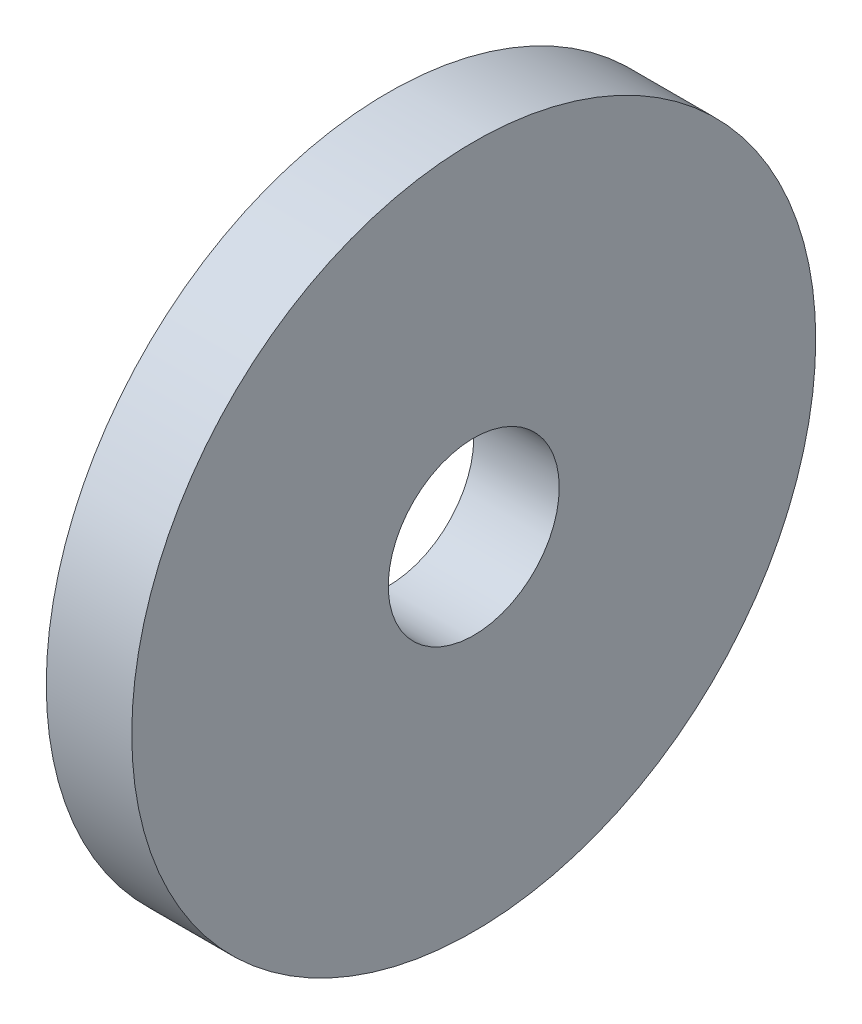
ISO-10303-21;
HEADER;
FILE_DESCRIPTION(('STEP AP214'),'2;1');
FILE_NAME('part.step','',(''),(''),'','','');
FILE_SCHEMA(('AUTOMOTIVE_DESIGN { 1 0 10303 214 1 1 1 1 }'));
ENDSEC;
DATA;
#1=APPLICATION_CONTEXT('core data for automotive mechanical design processes');
#2=APPLICATION_PROTOCOL_DEFINITION('international standard','automotive_design',2000,#1);
#3=PRODUCT_CONTEXT('',#1,'mechanical');
#4=PRODUCT('Part','Part','',(#3));
#5=PRODUCT_RELATED_PRODUCT_CATEGORY('part','',(#4));
#6=PRODUCT_DEFINITION_FORMATION('','',#4);
#7=PRODUCT_DEFINITION_CONTEXT('part definition',#1,'design');
#8=PRODUCT_DEFINITION('design','',#6,#7);
#9=PRODUCT_DEFINITION_SHAPE('','',#8);
#10=(LENGTH_UNIT() NAMED_UNIT(*) SI_UNIT(.MILLI.,.METRE.));
#11=(NAMED_UNIT(*) PLANE_ANGLE_UNIT() SI_UNIT($,.RADIAN.));
#12=(NAMED_UNIT(*) SI_UNIT($,.STERADIAN.) SOLID_ANGLE_UNIT());
#13=UNCERTAINTY_MEASURE_WITH_UNIT(LENGTH_MEASURE(1.E-05),#10,'distance_accuracy_value','');
#14=(GEOMETRIC_REPRESENTATION_CONTEXT(3) GLOBAL_UNCERTAINTY_ASSIGNED_CONTEXT((#13)) GLOBAL_UNIT_ASSIGNED_CONTEXT((#10,
#11,#12)) REPRESENTATION_CONTEXT('',''));
#15=CARTESIAN_POINT('',(0.,0.,0.));
#16=DIRECTION('',(0.,0.,1.));
#17=DIRECTION('',(1.,0.,0.));
#18=AXIS2_PLACEMENT_3D('',#15,#16,#17);
#19=CARTESIAN_POINT('',(3.175,0.,0.));
#20=DIRECTION('',(1.,0.,0.));
#21=DIRECTION('',(0.,0.,-1.));
#22=AXIS2_PLACEMENT_3D('',#19,#20,#21);
#23=PLANE('',#22);
#24=CARTESIAN_POINT('',(3.175,0.,0.));
#25=DIRECTION('',(1.,0.,0.));
#26=DIRECTION('',(0.,0.,-1.));
#27=AXIS2_PLACEMENT_3D('',#24,#25,#26);
#28=CIRCLE('',#27,12.7);
#29=CARTESIAN_POINT('',(3.175,0.,-12.7));
#30=VERTEX_POINT('',#29);
#31=EDGE_CURVE('E10',#30,#30,#28,.T.);
#32=ORIENTED_EDGE('',*,*,#31,.T.);
#33=EDGE_LOOP('',(#32));
#34=FACE_BOUND('',#33,.T.);
#35=CARTESIAN_POINT('',(3.175,0.,0.));
#36=DIRECTION('',(1.,0.,0.));
#37=DIRECTION('',(0.,0.,-1.));
#38=AXIS2_PLACEMENT_3D('',#35,#36,#37);
#39=CIRCLE('',#38,3.175);
#40=CARTESIAN_POINT('',(3.175,0.,-3.175));
#41=VERTEX_POINT('',#40);
#42=EDGE_CURVE('E56',#41,#41,#39,.T.);
#43=ORIENTED_EDGE('',*,*,#42,.F.);
#44=EDGE_LOOP('',(#43));
#45=FACE_BOUND('',#44,.T.);
#46=ADVANCED_FACE('F43',(#34,#45),#23,.T.);
#47=CARTESIAN_POINT('',(0.,0.,0.));
#48=DIRECTION('',(1.,0.,0.));
#49=DIRECTION('',(0.,0.,-1.));
#50=AXIS2_PLACEMENT_3D('',#47,#48,#49);
#51=PLANE('',#50);
#52=CARTESIAN_POINT('',(0.,0.,0.));
#53=DIRECTION('',(1.,0.,0.));
#54=DIRECTION('',(0.,0.,-1.));
#55=AXIS2_PLACEMENT_3D('',#52,#53,#54);
#56=CIRCLE('',#55,12.7);
#57=CARTESIAN_POINT('',(0.,0.,-12.7));
#58=VERTEX_POINT('',#57);
#59=EDGE_CURVE('E47',#58,#58,#56,.T.);
#60=ORIENTED_EDGE('',*,*,#59,.F.);
#61=EDGE_LOOP('',(#60));
#62=FACE_BOUND('',#61,.T.);
#63=CARTESIAN_POINT('',(0.,0.,0.));
#64=DIRECTION('',(1.,0.,0.));
#65=DIRECTION('',(0.,0.,-1.));
#66=AXIS2_PLACEMENT_3D('',#63,#64,#65);
#67=CIRCLE('',#66,3.175);
#68=CARTESIAN_POINT('',(0.,0.,-3.175));
#69=VERTEX_POINT('',#68);
#70=EDGE_CURVE('E58',#69,#69,#67,.T.);
#71=ORIENTED_EDGE('',*,*,#70,.T.);
#72=EDGE_LOOP('',(#71));
#73=FACE_BOUND('',#72,.T.);
#74=ADVANCED_FACE('F70',(#62,#73),#51,.F.);
#75=CARTESIAN_POINT('',(3.175,0.,0.));
#76=DIRECTION('',(-1.,0.,0.));
#77=DIRECTION('',(0.,0.,1.));
#78=AXIS2_PLACEMENT_3D('',#75,#76,#77);
#79=CYLINDRICAL_SURFACE('',#78,12.7);
#80=ORIENTED_EDGE('',*,*,#31,.F.);
#81=EDGE_LOOP('',(#80));
#82=FACE_BOUND('',#81,.T.);
#83=ORIENTED_EDGE('',*,*,#59,.T.);
#84=EDGE_LOOP('',(#83));
#85=FACE_BOUND('',#84,.T.);
#86=ADVANCED_FACE('F45',(#82,#85),#79,.T.);
#87=CARTESIAN_POINT('',(3.175,0.,0.));
#88=DIRECTION('',(-1.,0.,0.));
#89=DIRECTION('',(0.,0.,1.));
#90=AXIS2_PLACEMENT_3D('',#87,#88,#89);
#91=CYLINDRICAL_SURFACE('',#90,3.175);
#92=ORIENTED_EDGE('',*,*,#42,.T.);
#93=EDGE_LOOP('',(#92));
#94=FACE_BOUND('',#93,.T.);
#95=ORIENTED_EDGE('',*,*,#70,.F.);
#96=EDGE_LOOP('',(#95));
#97=FACE_BOUND('',#96,.T.);
#98=ADVANCED_FACE('F66',(#94,#97),#91,.F.);
#99=CLOSED_SHELL('',(#46,#74,#86,#98));
#100=MANIFOLD_SOLID_BREP('B2',#99);
#101=ADVANCED_BREP_SHAPE_REPRESENTATION('',(#18,#100),#14);
#102=SHAPE_DEFINITION_REPRESENTATION(#9,#101);
ENDSEC;
END-ISO-10303-21;
